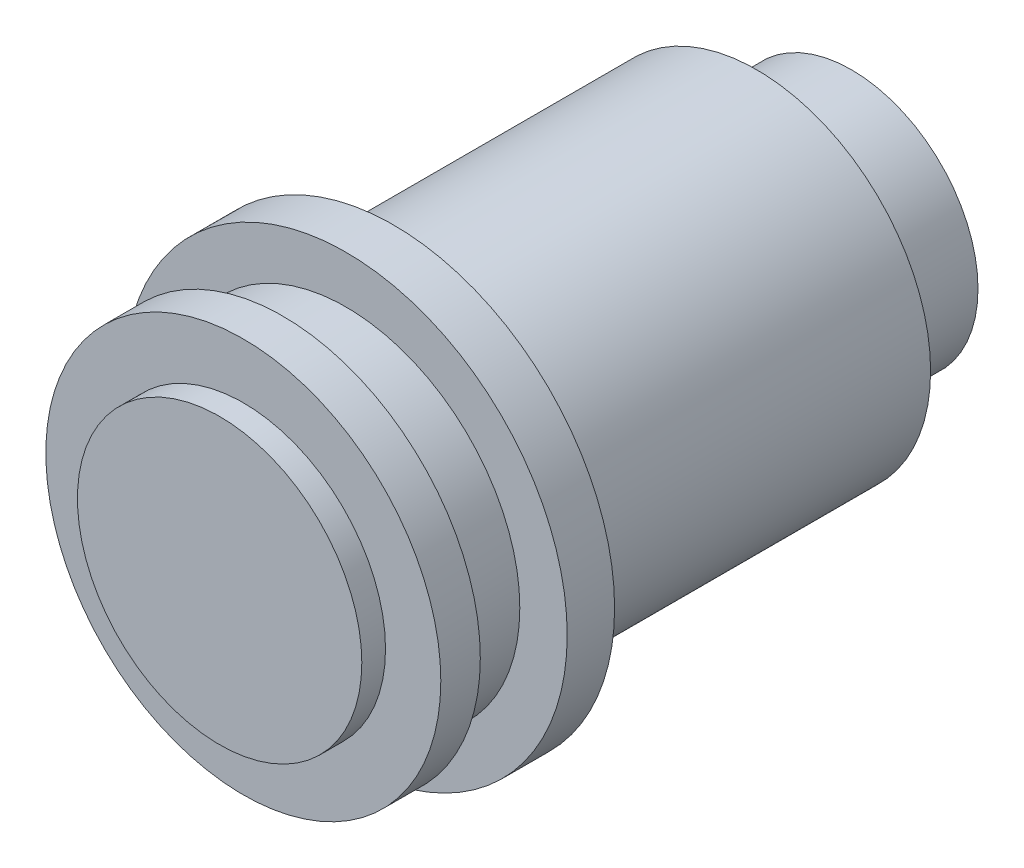
ISO-10303-21;
HEADER;
FILE_DESCRIPTION(('STEP AP214'),'2;1');
FILE_NAME('part.step','',(''),(''),'','','');
FILE_SCHEMA(('AUTOMOTIVE_DESIGN { 1 0 10303 214 1 1 1 1 }'));
ENDSEC;
DATA;
#1=APPLICATION_CONTEXT('core data for automotive mechanical design processes');
#2=APPLICATION_PROTOCOL_DEFINITION('international standard','automotive_design',2000,#1);
#3=PRODUCT_CONTEXT('',#1,'mechanical');
#4=PRODUCT('Part','Part','',(#3));
#5=PRODUCT_RELATED_PRODUCT_CATEGORY('part','',(#4));
#6=PRODUCT_DEFINITION_FORMATION('','',#4);
#7=PRODUCT_DEFINITION_CONTEXT('part definition',#1,'design');
#8=PRODUCT_DEFINITION('design','',#6,#7);
#9=PRODUCT_DEFINITION_SHAPE('','',#8);
#10=(LENGTH_UNIT() NAMED_UNIT(*) SI_UNIT(.MILLI.,.METRE.));
#11=(NAMED_UNIT(*) PLANE_ANGLE_UNIT() SI_UNIT($,.RADIAN.));
#12=(NAMED_UNIT(*) SI_UNIT($,.STERADIAN.) SOLID_ANGLE_UNIT());
#13=UNCERTAINTY_MEASURE_WITH_UNIT(LENGTH_MEASURE(1.E-05),#10,'distance_accuracy_value','');
#14=(GEOMETRIC_REPRESENTATION_CONTEXT(3) GLOBAL_UNCERTAINTY_ASSIGNED_CONTEXT((#13)) GLOBAL_UNIT_ASSIGNED_CONTEXT((#10,
#11,#12)) REPRESENTATION_CONTEXT('',''));
#15=CARTESIAN_POINT('',(0.,0.,0.));
#16=DIRECTION('',(0.,0.,1.));
#17=DIRECTION('',(1.,0.,0.));
#18=AXIS2_PLACEMENT_3D('',#15,#16,#17);
#19=CARTESIAN_POINT('',(0.,0.,-36.));
#20=DIRECTION('',(0.,0.,1.));
#21=DIRECTION('',(1.,0.,0.));
#22=AXIS2_PLACEMENT_3D('',#19,#20,#21);
#23=PLANE('',#22);
#24=CARTESIAN_POINT('',(0.,0.,-36.));
#25=DIRECTION('',(0.,0.,1.));
#26=DIRECTION('',(1.,0.,0.));
#27=AXIS2_PLACEMENT_3D('',#24,#25,#26);
#28=CIRCLE('',#27,8.);
#29=CARTESIAN_POINT('',(8.,0.,-36.));
#30=VERTEX_POINT('',#29);
#31=EDGE_CURVE('E9',#30,#30,#28,.T.);
#32=ORIENTED_EDGE('',*,*,#31,.F.);
#33=EDGE_LOOP('',(#32));
#34=FACE_BOUND('',#33,.T.);
#35=ADVANCED_FACE('F14',(#34),#23,.F.);
#36=CARTESIAN_POINT('',(0.,0.,-36.));
#37=DIRECTION('',(0.,0.,1.));
#38=DIRECTION('',(1.,0.,0.));
#39=AXIS2_PLACEMENT_3D('',#36,#37,#38);
#40=CYLINDRICAL_SURFACE('',#39,8.);
#41=CARTESIAN_POINT('',(0.,0.,-30.));
#42=DIRECTION('',(0.,0.,1.));
#43=DIRECTION('',(1.,0.,0.));
#44=AXIS2_PLACEMENT_3D('',#41,#42,#43);
#45=CIRCLE('',#44,8.);
#46=CARTESIAN_POINT('',(8.,0.,-30.));
#47=VERTEX_POINT('',#46);
#48=EDGE_CURVE('E102',#47,#47,#45,.T.);
#49=ORIENTED_EDGE('',*,*,#48,.F.);
#50=DIRECTION('',(0.,0.,1.));
#51=VECTOR('',#50,1.);
#52=CARTESIAN_POINT('',(8.,0.,-36.));
#53=LINE('',#52,#51);
#54=EDGE_CURVE('E18',#30,#47,#53,.T.);
#55=ORIENTED_EDGE('',*,*,#54,.F.);
#56=ORIENTED_EDGE('',*,*,#31,.T.);
#57=ORIENTED_EDGE('',*,*,#54,.T.);
#58=EDGE_LOOP('',(#49,#55,#56,#57));
#59=FACE_BOUND('',#58,.T.);
#60=ADVANCED_FACE('F174',(#59),#40,.T.);
#61=CARTESIAN_POINT('',(0.,0.,-30.));
#62=DIRECTION('',(0.,0.,1.));
#63=DIRECTION('',(1.,0.,0.));
#64=AXIS2_PLACEMENT_3D('',#61,#62,#63);
#65=PLANE('',#64);
#66=ORIENTED_EDGE('',*,*,#48,.T.);
#67=EDGE_LOOP('',(#66));
#68=FACE_BOUND('',#67,.T.);
#69=CARTESIAN_POINT('',(0.,0.,-30.));
#70=DIRECTION('',(0.,0.,1.));
#71=DIRECTION('',(1.,0.,0.));
#72=AXIS2_PLACEMENT_3D('',#69,#70,#71);
#73=CIRCLE('',#72,11.);
#74=CARTESIAN_POINT('',(11.,0.,-30.));
#75=VERTEX_POINT('',#74);
#76=EDGE_CURVE('E95',#75,#75,#73,.T.);
#77=ORIENTED_EDGE('',*,*,#76,.F.);
#78=EDGE_LOOP('',(#77));
#79=FACE_BOUND('',#78,.T.);
#80=ADVANCED_FACE('F180',(#68,#79),#65,.F.);
#81=CARTESIAN_POINT('',(0.,0.,-30.));
#82=DIRECTION('',(0.,0.,1.));
#83=DIRECTION('',(1.,0.,0.));
#84=AXIS2_PLACEMENT_3D('',#81,#82,#83);
#85=CYLINDRICAL_SURFACE('',#84,11.);
#86=CARTESIAN_POINT('',(0.,0.,-7.));
#87=DIRECTION('',(0.,0.,1.));
#88=DIRECTION('',(1.,0.,0.));
#89=AXIS2_PLACEMENT_3D('',#86,#87,#88);
#90=CIRCLE('',#89,11.);
#91=CARTESIAN_POINT('',(11.,0.,-7.));
#92=VERTEX_POINT('',#91);
#93=EDGE_CURVE('E111',#92,#92,#90,.T.);
#94=ORIENTED_EDGE('',*,*,#93,.F.);
#95=DIRECTION('',(0.,0.,1.));
#96=VECTOR('',#95,1.);
#97=CARTESIAN_POINT('',(11.,0.,-30.));
#98=LINE('',#97,#96);
#99=EDGE_CURVE('E98',#75,#92,#98,.T.);
#100=ORIENTED_EDGE('',*,*,#99,.F.);
#101=ORIENTED_EDGE('',*,*,#76,.T.);
#102=ORIENTED_EDGE('',*,*,#99,.T.);
#103=EDGE_LOOP('',(#94,#100,#101,#102));
#104=FACE_BOUND('',#103,.T.);
#105=ADVANCED_FACE('F97',(#104),#85,.T.);
#106=CARTESIAN_POINT('',(0.,0.,-7.));
#107=DIRECTION('',(0.,0.,1.));
#108=DIRECTION('',(1.,0.,0.));
#109=AXIS2_PLACEMENT_3D('',#106,#107,#108);
#110=PLANE('',#109);
#111=ORIENTED_EDGE('',*,*,#93,.T.);
#112=EDGE_LOOP('',(#111));
#113=FACE_BOUND('',#112,.T.);
#114=CARTESIAN_POINT('',(0.,0.,-7.));
#115=DIRECTION('',(0.,0.,1.));
#116=DIRECTION('',(1.,0.,0.));
#117=AXIS2_PLACEMENT_3D('',#114,#115,#116);
#118=CIRCLE('',#117,14.);
#119=CARTESIAN_POINT('',(14.,0.,-7.));
#120=VERTEX_POINT('',#119);
#121=EDGE_CURVE('E80',#120,#120,#118,.T.);
#122=ORIENTED_EDGE('',*,*,#121,.F.);
#123=EDGE_LOOP('',(#122));
#124=FACE_BOUND('',#123,.T.);
#125=ADVANCED_FACE('F16',(#113,#124),#110,.F.);
#126=CARTESIAN_POINT('',(0.,0.,-7.));
#127=DIRECTION('',(0.,0.,1.));
#128=DIRECTION('',(1.,0.,0.));
#129=AXIS2_PLACEMENT_3D('',#126,#127,#128);
#130=CYLINDRICAL_SURFACE('',#129,14.);
#131=CARTESIAN_POINT('',(0.,0.,-4.));
#132=DIRECTION('',(0.,0.,1.));
#133=DIRECTION('',(1.,0.,0.));
#134=AXIS2_PLACEMENT_3D('',#131,#132,#133);
#135=CIRCLE('',#134,14.);
#136=CARTESIAN_POINT('',(14.,0.,-4.));
#137=VERTEX_POINT('',#136);
#138=EDGE_CURVE('E135',#137,#137,#135,.T.);
#139=ORIENTED_EDGE('',*,*,#138,.F.);
#140=DIRECTION('',(0.,0.,1.));
#141=VECTOR('',#140,1.);
#142=CARTESIAN_POINT('',(14.,0.,-7.));
#143=LINE('',#142,#141);
#144=EDGE_CURVE('E85',#120,#137,#143,.T.);
#145=ORIENTED_EDGE('',*,*,#144,.F.);
#146=ORIENTED_EDGE('',*,*,#121,.T.);
#147=ORIENTED_EDGE('',*,*,#144,.T.);
#148=EDGE_LOOP('',(#139,#145,#146,#147));
#149=FACE_BOUND('',#148,.T.);
#150=ADVANCED_FACE('F185',(#149),#130,.T.);
#151=CARTESIAN_POINT('',(0.,0.,-4.));
#152=DIRECTION('',(0.,0.,1.));
#153=DIRECTION('',(1.,0.,0.));
#154=AXIS2_PLACEMENT_3D('',#151,#152,#153);
#155=PLANE('',#154);
#156=CARTESIAN_POINT('',(0.,0.,-4.));
#157=DIRECTION('',(0.,0.,1.));
#158=DIRECTION('',(1.,0.,0.));
#159=AXIS2_PLACEMENT_3D('',#156,#157,#158);
#160=CIRCLE('',#159,11.);
#161=CARTESIAN_POINT('',(11.,0.,-4.));
#162=VERTEX_POINT('',#161);
#163=EDGE_CURVE('E132',#162,#162,#160,.T.);
#164=ORIENTED_EDGE('',*,*,#163,.F.);
#165=EDGE_LOOP('',(#164));
#166=FACE_BOUND('',#165,.T.);
#167=ORIENTED_EDGE('',*,*,#138,.T.);
#168=EDGE_LOOP('',(#167));
#169=FACE_BOUND('',#168,.T.);
#170=ADVANCED_FACE('F183',(#166,#169),#155,.T.);
#171=CARTESIAN_POINT('',(0.,0.,4.));
#172=DIRECTION('',(0.,0.,1.));
#173=DIRECTION('',(1.,0.,0.));
#174=AXIS2_PLACEMENT_3D('',#171,#172,#173);
#175=PLANE('',#174);
#176=CARTESIAN_POINT('',(0.,0.,4.));
#177=DIRECTION('',(0.,0.,1.));
#178=DIRECTION('',(1.,0.,0.));
#179=AXIS2_PLACEMENT_3D('',#176,#177,#178);
#180=CIRCLE('',#179,9.);
#181=CARTESIAN_POINT('',(9.,0.,4.));
#182=VERTEX_POINT('',#181);
#183=EDGE_CURVE('E129',#182,#182,#180,.T.);
#184=ORIENTED_EDGE('',*,*,#183,.T.);
#185=EDGE_LOOP('',(#184));
#186=FACE_BOUND('',#185,.T.);
#187=ADVANCED_FACE('F155',(#186),#175,.T.);
#188=CARTESIAN_POINT('',(0.,0.,-30.));
#189=DIRECTION('',(0.,0.,1.));
#190=DIRECTION('',(1.,0.,0.));
#191=AXIS2_PLACEMENT_3D('',#188,#189,#190);
#192=CYLINDRICAL_SURFACE('',#191,11.);
#193=DIRECTION('',(0.,0.,1.));
#194=VECTOR('',#193,1.);
#195=CARTESIAN_POINT('',(11.,0.,-30.));
#196=LINE('',#195,#194);
#197=CARTESIAN_POINT('',(11.,0.,0.));
#198=VERTEX_POINT('',#197);
#199=EDGE_CURVE('E128',#162,#198,#196,.T.);
#200=ORIENTED_EDGE('',*,*,#199,.T.);
#201=CARTESIAN_POINT('',(0.,0.,0.));
#202=DIRECTION('',(0.,0.,1.));
#203=DIRECTION('',(1.,0.,0.));
#204=AXIS2_PLACEMENT_3D('',#201,#202,#203);
#205=CIRCLE('',#204,11.);
#206=EDGE_CURVE('E121',#198,#198,#205,.T.);
#207=ORIENTED_EDGE('',*,*,#206,.F.);
#208=ORIENTED_EDGE('',*,*,#199,.F.);
#209=ORIENTED_EDGE('',*,*,#163,.T.);
#210=EDGE_LOOP('',(#200,#207,#208,#209));
#211=FACE_BOUND('',#210,.T.);
#212=ADVANCED_FACE('F191',(#211),#192,.T.);
#213=CARTESIAN_POINT('',(0.,0.,2.5));
#214=DIRECTION('',(0.,0.,1.));
#215=DIRECTION('',(1.,0.,0.));
#216=AXIS2_PLACEMENT_3D('',#213,#214,#215);
#217=CYLINDRICAL_SURFACE('',#216,9.);
#218=ORIENTED_EDGE('',*,*,#183,.F.);
#219=DIRECTION('',(0.,0.,1.));
#220=VECTOR('',#219,1.);
#221=CARTESIAN_POINT('',(9.,0.,2.5));
#222=LINE('',#221,#220);
#223=CARTESIAN_POINT('',(9.,0.,2.5));
#224=VERTEX_POINT('',#223);
#225=EDGE_CURVE('E124',#224,#182,#222,.T.);
#226=ORIENTED_EDGE('',*,*,#225,.F.);
#227=CARTESIAN_POINT('',(0.,0.,2.5));
#228=DIRECTION('',(0.,0.,1.));
#229=DIRECTION('',(1.,0.,0.));
#230=AXIS2_PLACEMENT_3D('',#227,#228,#229);
#231=CIRCLE('',#230,9.);
#232=EDGE_CURVE('E117',#224,#224,#231,.T.);
#233=ORIENTED_EDGE('',*,*,#232,.T.);
#234=ORIENTED_EDGE('',*,*,#225,.T.);
#235=EDGE_LOOP('',(#218,#226,#233,#234));
#236=FACE_BOUND('',#235,.T.);
#237=ADVANCED_FACE('F157',(#236),#217,.T.);
#238=CARTESIAN_POINT('',(0.,0.,0.));
#239=DIRECTION('',(0.,0.,1.));
#240=DIRECTION('',(1.,0.,0.));
#241=AXIS2_PLACEMENT_3D('',#238,#239,#240);
#242=PLANE('',#241);
#243=ORIENTED_EDGE('',*,*,#206,.T.);
#244=EDGE_LOOP('',(#243));
#245=FACE_BOUND('',#244,.T.);
#246=CARTESIAN_POINT('',(0.,0.,0.));
#247=DIRECTION('',(0.,0.,1.));
#248=DIRECTION('',(1.,0.,0.));
#249=AXIS2_PLACEMENT_3D('',#246,#247,#248);
#250=CIRCLE('',#249,12.5);
#251=CARTESIAN_POINT('',(12.5,0.,0.));
#252=VERTEX_POINT('',#251);
#253=EDGE_CURVE('E62',#252,#252,#250,.T.);
#254=ORIENTED_EDGE('',*,*,#253,.F.);
#255=EDGE_LOOP('',(#254));
#256=FACE_BOUND('',#255,.T.);
#257=ADVANCED_FACE('F164',(#245,#256),#242,.F.);
#258=CARTESIAN_POINT('',(0.,0.,2.5));
#259=DIRECTION('',(0.,0.,1.));
#260=DIRECTION('',(1.,0.,0.));
#261=AXIS2_PLACEMENT_3D('',#258,#259,#260);
#262=PLANE('',#261);
#263=ORIENTED_EDGE('',*,*,#232,.F.);
#264=EDGE_LOOP('',(#263));
#265=FACE_BOUND('',#264,.T.);
#266=CARTESIAN_POINT('',(0.,0.,2.5));
#267=DIRECTION('',(0.,0.,1.));
#268=DIRECTION('',(1.,0.,0.));
#269=AXIS2_PLACEMENT_3D('',#266,#267,#268);
#270=CIRCLE('',#269,12.5);
#271=CARTESIAN_POINT('',(12.5,0.,2.5));
#272=VERTEX_POINT('',#271);
#273=EDGE_CURVE('E114',#272,#272,#270,.T.);
#274=ORIENTED_EDGE('',*,*,#273,.T.);
#275=EDGE_LOOP('',(#274));
#276=FACE_BOUND('',#275,.T.);
#277=ADVANCED_FACE('F160',(#265,#276),#262,.T.);
#278=CARTESIAN_POINT('',(0.,0.,0.));
#279=DIRECTION('',(0.,0.,1.));
#280=DIRECTION('',(1.,0.,0.));
#281=AXIS2_PLACEMENT_3D('',#278,#279,#280);
#282=CYLINDRICAL_SURFACE('',#281,12.5);
#283=ORIENTED_EDGE('',*,*,#273,.F.);
#284=DIRECTION('',(0.,0.,1.));
#285=VECTOR('',#284,1.);
#286=CARTESIAN_POINT('',(12.5,0.,0.));
#287=LINE('',#286,#285);
#288=EDGE_CURVE('E69',#252,#272,#287,.T.);
#289=ORIENTED_EDGE('',*,*,#288,.F.);
#290=ORIENTED_EDGE('',*,*,#253,.T.);
#291=ORIENTED_EDGE('',*,*,#288,.T.);
#292=EDGE_LOOP('',(#283,#289,#290,#291));
#293=FACE_BOUND('',#292,.T.);
#294=ADVANCED_FACE('F163',(#293),#282,.T.);
#295=CLOSED_SHELL('',(#35,#60,#80,#105,#125,#150,#170,#187,#212,#237,#257,#277,#294));
#296=MANIFOLD_SOLID_BREP('B1',#295);
#297=ADVANCED_BREP_SHAPE_REPRESENTATION('',(#18,#296),#14);
#298=SHAPE_DEFINITION_REPRESENTATION(#9,#297);
ENDSEC;
END-ISO-10303-21;
